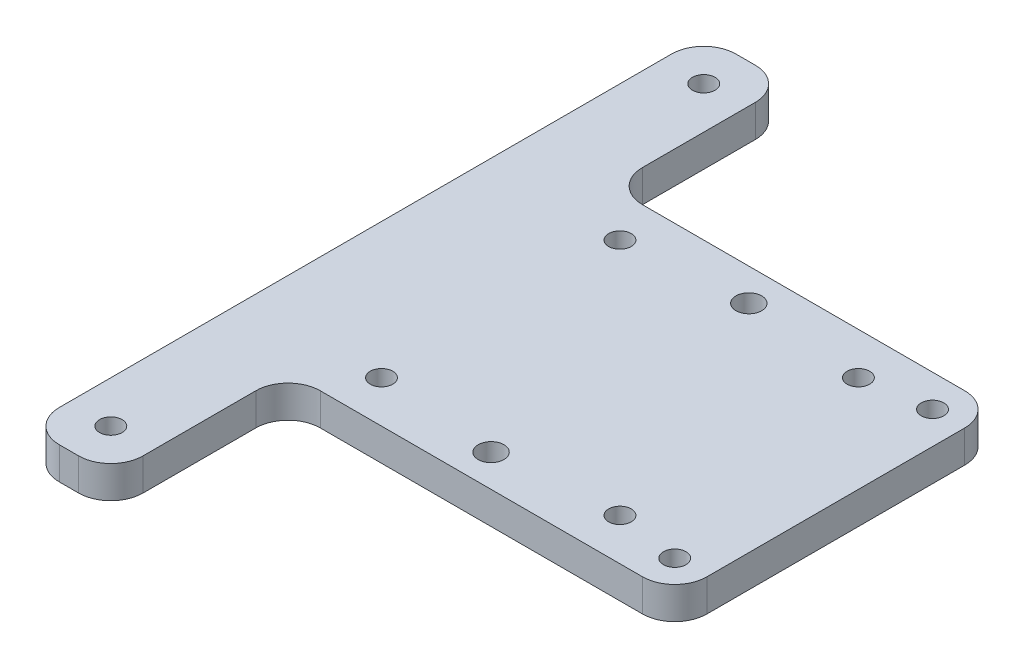
ISO-10303-21;
HEADER;
FILE_DESCRIPTION(('STEP AP214'),'2;1');
FILE_NAME('part.step','',(''),(''),'','','');
FILE_SCHEMA(('AUTOMOTIVE_DESIGN { 1 0 10303 214 1 1 1 1 }'));
ENDSEC;
DATA;
#1=APPLICATION_CONTEXT('core data for automotive mechanical design processes');
#2=APPLICATION_PROTOCOL_DEFINITION('international standard','automotive_design',2000,#1);
#3=PRODUCT_CONTEXT('',#1,'mechanical');
#4=PRODUCT('Part','Part','',(#3));
#5=PRODUCT_RELATED_PRODUCT_CATEGORY('part','',(#4));
#6=PRODUCT_DEFINITION_FORMATION('','',#4);
#7=PRODUCT_DEFINITION_CONTEXT('part definition',#1,'design');
#8=PRODUCT_DEFINITION('design','',#6,#7);
#9=PRODUCT_DEFINITION_SHAPE('','',#8);
#10=(LENGTH_UNIT() NAMED_UNIT(*) SI_UNIT(.MILLI.,.METRE.));
#11=(NAMED_UNIT(*) PLANE_ANGLE_UNIT() SI_UNIT($,.RADIAN.));
#12=(NAMED_UNIT(*) SI_UNIT($,.STERADIAN.) SOLID_ANGLE_UNIT());
#13=UNCERTAINTY_MEASURE_WITH_UNIT(LENGTH_MEASURE(1.E-05),#10,'distance_accuracy_value','');
#14=(GEOMETRIC_REPRESENTATION_CONTEXT(3) GLOBAL_UNCERTAINTY_ASSIGNED_CONTEXT((#13)) GLOBAL_UNIT_ASSIGNED_CONTEXT((#10,
#11,#12)) REPRESENTATION_CONTEXT('',''));
#15=CARTESIAN_POINT('',(0.,0.,0.));
#16=DIRECTION('',(0.,0.,1.));
#17=DIRECTION('',(1.,0.,0.));
#18=AXIS2_PLACEMENT_3D('',#15,#16,#17);
#19=CARTESIAN_POINT('',(0.,5.,-25.));
#20=DIRECTION('',(-1.,0.,0.));
#21=DIRECTION('',(0.,0.,1.));
#22=AXIS2_PLACEMENT_3D('',#19,#20,#21);
#23=PLANE('',#22);
#24=DIRECTION('',(0.,0.,-1.));
#25=VECTOR('',#24,1.);
#26=CARTESIAN_POINT('',(0.,0.,-25.));
#27=LINE('',#26,#25);
#28=CARTESIAN_POINT('',(0.,0.,20.));
#29=VERTEX_POINT('',#28);
#30=CARTESIAN_POINT('',(0.,0.,-20.));
#31=VERTEX_POINT('',#30);
#32=EDGE_CURVE('E265',#29,#31,#27,.T.);
#33=ORIENTED_EDGE('',*,*,#32,.T.);
#34=DIRECTION('',(0.,-1.,0.));
#35=VECTOR('',#34,1.);
#36=CARTESIAN_POINT('',(0.,5.,-20.));
#37=LINE('',#36,#35);
#38=CARTESIAN_POINT('',(0.,5.,-20.));
#39=VERTEX_POINT('',#38);
#40=EDGE_CURVE('E223',#31,#39,#37,.F.);
#41=ORIENTED_EDGE('',*,*,#40,.T.);
#42=DIRECTION('',(0.,0.,-1.));
#43=VECTOR('',#42,1.);
#44=CARTESIAN_POINT('',(0.,5.,-25.));
#45=LINE('',#44,#43);
#46=CARTESIAN_POINT('',(0.,5.,20.));
#47=VERTEX_POINT('',#46);
#48=EDGE_CURVE('E174',#47,#39,#45,.T.);
#49=ORIENTED_EDGE('',*,*,#48,.F.);
#50=DIRECTION('',(0.,-1.,0.));
#51=VECTOR('',#50,1.);
#52=CARTESIAN_POINT('',(0.,5.,20.));
#53=LINE('',#52,#51);
#54=EDGE_CURVE('E220',#47,#29,#53,.T.);
#55=ORIENTED_EDGE('',*,*,#54,.T.);
#56=EDGE_LOOP('',(#33,#41,#49,#55));
#57=FACE_BOUND('',#56,.T.);
#58=ADVANCED_FACE('F33',(#57),#23,.F.);
#59=CARTESIAN_POINT('',(-60.,5.,-25.));
#60=DIRECTION('',(0.,0.,1.));
#61=DIRECTION('',(1.,0.,0.));
#62=AXIS2_PLACEMENT_3D('',#59,#60,#61);
#63=PLANE('',#62);
#64=DIRECTION('',(-1.,0.,0.));
#65=VECTOR('',#64,1.);
#66=CARTESIAN_POINT('',(-60.,0.,-25.));
#67=LINE('',#66,#65);
#68=CARTESIAN_POINT('',(-5.00000000000001,0.,-25.));
#69=VERTEX_POINT('',#68);
#70=CARTESIAN_POINT('',(-55.,0.,-25.));
#71=VERTEX_POINT('',#70);
#72=EDGE_CURVE('E260',#69,#71,#67,.T.);
#73=ORIENTED_EDGE('',*,*,#72,.T.);
#74=DIRECTION('',(0.,-1.,0.));
#75=VECTOR('',#74,1.);
#76=CARTESIAN_POINT('',(-55.,5.,-25.));
#77=LINE('',#76,#75);
#78=CARTESIAN_POINT('',(-55.,5.,-25.));
#79=VERTEX_POINT('',#78);
#80=EDGE_CURVE('E218',#71,#79,#77,.F.);
#81=ORIENTED_EDGE('',*,*,#80,.T.);
#82=DIRECTION('',(-1.,0.,0.));
#83=VECTOR('',#82,1.);
#84=CARTESIAN_POINT('',(-60.,5.,-25.));
#85=LINE('',#84,#83);
#86=CARTESIAN_POINT('',(-5.00000000000001,5.,-25.));
#87=VERTEX_POINT('',#86);
#88=EDGE_CURVE('E246',#87,#79,#85,.T.);
#89=ORIENTED_EDGE('',*,*,#88,.F.);
#90=DIRECTION('',(0.,-1.,0.));
#91=VECTOR('',#90,1.);
#92=CARTESIAN_POINT('',(-5.00000000000001,5.,-25.));
#93=LINE('',#92,#91);
#94=EDGE_CURVE('E215',#87,#69,#93,.T.);
#95=ORIENTED_EDGE('',*,*,#94,.T.);
#96=EDGE_LOOP('',(#73,#81,#89,#95));
#97=FACE_BOUND('',#96,.T.);
#98=ADVANCED_FACE('F263',(#97),#63,.F.);
#99=CARTESIAN_POINT('',(-60.,5.,-52.5));
#100=DIRECTION('',(-1.,0.,0.));
#101=DIRECTION('',(0.,0.,1.));
#102=AXIS2_PLACEMENT_3D('',#99,#100,#101);
#103=PLANE('',#102);
#104=DIRECTION('',(0.,0.,-1.));
#105=VECTOR('',#104,1.);
#106=CARTESIAN_POINT('',(-60.,0.,-52.5));
#107=LINE('',#106,#105);
#108=CARTESIAN_POINT('',(-60.,0.,-30.));
#109=VERTEX_POINT('',#108);
#110=CARTESIAN_POINT('',(-60.,0.,-47.5));
#111=VERTEX_POINT('',#110);
#112=EDGE_CURVE('E261',#109,#111,#107,.T.);
#113=ORIENTED_EDGE('',*,*,#112,.T.);
#114=DIRECTION('',(0.,-1.,0.));
#115=VECTOR('',#114,1.);
#116=CARTESIAN_POINT('',(-60.,5.,-47.5));
#117=LINE('',#116,#115);
#118=CARTESIAN_POINT('',(-60.,5.,-47.5));
#119=VERTEX_POINT('',#118);
#120=EDGE_CURVE('E213',#111,#119,#117,.F.);
#121=ORIENTED_EDGE('',*,*,#120,.T.);
#122=DIRECTION('',(0.,0.,-1.));
#123=VECTOR('',#122,1.);
#124=CARTESIAN_POINT('',(-60.,5.,-52.5));
#125=LINE('',#124,#123);
#126=CARTESIAN_POINT('',(-60.,5.,-30.));
#127=VERTEX_POINT('',#126);
#128=EDGE_CURVE('E243',#127,#119,#125,.T.);
#129=ORIENTED_EDGE('',*,*,#128,.F.);
#130=DIRECTION('',(0.,-1.,0.));
#131=VECTOR('',#130,1.);
#132=CARTESIAN_POINT('',(-60.,0.,-30.));
#133=LINE('',#132,#131);
#134=EDGE_CURVE('E210',#127,#109,#133,.T.);
#135=ORIENTED_EDGE('',*,*,#134,.T.);
#136=EDGE_LOOP('',(#113,#121,#129,#135));
#137=FACE_BOUND('',#136,.T.);
#138=ADVANCED_FACE('F252',(#137),#103,.F.);
#139=CARTESIAN_POINT('',(-73.,5.,-52.5));
#140=DIRECTION('',(0.,0.,1.));
#141=DIRECTION('',(1.,0.,0.));
#142=AXIS2_PLACEMENT_3D('',#139,#140,#141);
#143=PLANE('',#142);
#144=DIRECTION('',(-1.,0.,0.));
#145=VECTOR('',#144,1.);
#146=CARTESIAN_POINT('',(-73.,5.,-52.5));
#147=LINE('',#146,#145);
#148=CARTESIAN_POINT('',(-65.,5.,-52.5));
#149=VERTEX_POINT('',#148);
#150=CARTESIAN_POINT('',(-68.,5.,-52.5));
#151=VERTEX_POINT('',#150);
#152=EDGE_CURVE('E255',#149,#151,#147,.T.);
#153=ORIENTED_EDGE('',*,*,#152,.F.);
#154=DIRECTION('',(0.,-1.,0.));
#155=VECTOR('',#154,1.);
#156=CARTESIAN_POINT('',(-65.,5.,-52.5));
#157=LINE('',#156,#155);
#158=CARTESIAN_POINT('',(-65.,0.,-52.5));
#159=VERTEX_POINT('',#158);
#160=EDGE_CURVE('E207',#149,#159,#157,.T.);
#161=ORIENTED_EDGE('',*,*,#160,.T.);
#162=DIRECTION('',(-1.,0.,0.));
#163=VECTOR('',#162,1.);
#164=CARTESIAN_POINT('',(-73.,0.,-52.5));
#165=LINE('',#164,#163);
#166=CARTESIAN_POINT('',(-68.,0.,-52.5));
#167=VERTEX_POINT('',#166);
#168=EDGE_CURVE('E267',#159,#167,#165,.T.);
#169=ORIENTED_EDGE('',*,*,#168,.T.);
#170=DIRECTION('',(0.,-1.,0.));
#171=VECTOR('',#170,1.);
#172=CARTESIAN_POINT('',(-68.,5.,-52.5));
#173=LINE('',#172,#171);
#174=EDGE_CURVE('E205',#167,#151,#173,.F.);
#175=ORIENTED_EDGE('',*,*,#174,.T.);
#176=EDGE_LOOP('',(#153,#161,#169,#175));
#177=FACE_BOUND('',#176,.T.);
#178=ADVANCED_FACE('F322',(#177),#143,.F.);
#179=CARTESIAN_POINT('',(-73.,5.,-52.5));
#180=DIRECTION('',(1.,0.,0.));
#181=DIRECTION('',(0.,0.,-1.));
#182=AXIS2_PLACEMENT_3D('',#179,#180,#181);
#183=PLANE('',#182);
#184=DIRECTION('',(0.,0.,1.));
#185=VECTOR('',#184,1.);
#186=CARTESIAN_POINT('',(-73.,0.,-52.5));
#187=LINE('',#186,#185);
#188=CARTESIAN_POINT('',(-73.,0.,-47.5));
#189=VERTEX_POINT('',#188);
#190=CARTESIAN_POINT('',(-73.,0.,47.5));
#191=VERTEX_POINT('',#190);
#192=EDGE_CURVE('E176',#189,#191,#187,.T.);
#193=ORIENTED_EDGE('',*,*,#192,.T.);
#194=DIRECTION('',(0.,-1.,0.));
#195=VECTOR('',#194,1.);
#196=CARTESIAN_POINT('',(-73.,5.,47.5));
#197=LINE('',#196,#195);
#198=CARTESIAN_POINT('',(-73.,5.,47.5));
#199=VERTEX_POINT('',#198);
#200=EDGE_CURVE('E232',#191,#199,#197,.F.);
#201=ORIENTED_EDGE('',*,*,#200,.T.);
#202=DIRECTION('',(0.,0.,1.));
#203=VECTOR('',#202,1.);
#204=CARTESIAN_POINT('',(-73.,5.,-52.5));
#205=LINE('',#204,#203);
#206=CARTESIAN_POINT('',(-73.,5.,-47.5));
#207=VERTEX_POINT('',#206);
#208=EDGE_CURVE('E289',#207,#199,#205,.T.);
#209=ORIENTED_EDGE('',*,*,#208,.F.);
#210=DIRECTION('',(0.,-1.,0.));
#211=VECTOR('',#210,1.);
#212=CARTESIAN_POINT('',(-73.,5.,-47.5));
#213=LINE('',#212,#211);
#214=EDGE_CURVE('E229',#207,#189,#213,.T.);
#215=ORIENTED_EDGE('',*,*,#214,.T.);
#216=EDGE_LOOP('',(#193,#201,#209,#215));
#217=FACE_BOUND('',#216,.T.);
#218=ADVANCED_FACE('F279',(#217),#183,.F.);
#219=CARTESIAN_POINT('',(-73.,5.,52.5));
#220=DIRECTION('',(0.,0.,-1.));
#221=DIRECTION('',(-1.,0.,0.));
#222=AXIS2_PLACEMENT_3D('',#219,#220,#221);
#223=PLANE('',#222);
#224=DIRECTION('',(1.,0.,0.));
#225=VECTOR('',#224,1.);
#226=CARTESIAN_POINT('',(-73.,0.,52.5));
#227=LINE('',#226,#225);
#228=CARTESIAN_POINT('',(-68.,0.,52.5));
#229=VERTEX_POINT('',#228);
#230=CARTESIAN_POINT('',(-65.,0.,52.5));
#231=VERTEX_POINT('',#230);
#232=EDGE_CURVE('E172',#229,#231,#227,.T.);
#233=ORIENTED_EDGE('',*,*,#232,.T.);
#234=DIRECTION('',(0.,-1.,0.));
#235=VECTOR('',#234,1.);
#236=CARTESIAN_POINT('',(-65.,5.,52.5));
#237=LINE('',#236,#235);
#238=CARTESIAN_POINT('',(-65.,5.,52.5));
#239=VERTEX_POINT('',#238);
#240=EDGE_CURVE('E151',#231,#239,#237,.F.);
#241=ORIENTED_EDGE('',*,*,#240,.T.);
#242=DIRECTION('',(1.,0.,0.));
#243=VECTOR('',#242,1.);
#244=CARTESIAN_POINT('',(-73.,5.,52.5));
#245=LINE('',#244,#243);
#246=CARTESIAN_POINT('',(-68.,5.,52.5));
#247=VERTEX_POINT('',#246);
#248=EDGE_CURVE('E288',#247,#239,#245,.T.);
#249=ORIENTED_EDGE('',*,*,#248,.F.);
#250=DIRECTION('',(0.,-1.,0.));
#251=VECTOR('',#250,1.);
#252=CARTESIAN_POINT('',(-68.,5.,52.5));
#253=LINE('',#252,#251);
#254=EDGE_CURVE('E156',#247,#229,#253,.T.);
#255=ORIENTED_EDGE('',*,*,#254,.T.);
#256=EDGE_LOOP('',(#233,#241,#249,#255));
#257=FACE_BOUND('',#256,.T.);
#258=ADVANCED_FACE('F291',(#257),#223,.F.);
#259=CARTESIAN_POINT('',(-60.,5.,25.));
#260=DIRECTION('',(-1.,0.,0.));
#261=DIRECTION('',(0.,0.,1.));
#262=AXIS2_PLACEMENT_3D('',#259,#260,#261);
#263=PLANE('',#262);
#264=DIRECTION('',(0.,0.,-1.));
#265=VECTOR('',#264,1.);
#266=CARTESIAN_POINT('',(-60.,5.,25.));
#267=LINE('',#266,#265);
#268=CARTESIAN_POINT('',(-60.,5.,47.5));
#269=VERTEX_POINT('',#268);
#270=CARTESIAN_POINT('',(-60.,5.,30.));
#271=VERTEX_POINT('',#270);
#272=EDGE_CURVE('E165',#269,#271,#267,.T.);
#273=ORIENTED_EDGE('',*,*,#272,.F.);
#274=DIRECTION('',(0.,-1.,0.));
#275=VECTOR('',#274,1.);
#276=CARTESIAN_POINT('',(-60.,5.,47.5));
#277=LINE('',#276,#275);
#278=CARTESIAN_POINT('',(-60.,0.,47.5));
#279=VERTEX_POINT('',#278);
#280=EDGE_CURVE('E150',#269,#279,#277,.T.);
#281=ORIENTED_EDGE('',*,*,#280,.T.);
#282=DIRECTION('',(0.,0.,-1.));
#283=VECTOR('',#282,1.);
#284=CARTESIAN_POINT('',(-60.,0.,25.));
#285=LINE('',#284,#283);
#286=CARTESIAN_POINT('',(-60.,0.,30.));
#287=VERTEX_POINT('',#286);
#288=EDGE_CURVE('E163',#279,#287,#285,.T.);
#289=ORIENTED_EDGE('',*,*,#288,.T.);
#290=DIRECTION('',(0.,-1.,0.));
#291=VECTOR('',#290,1.);
#292=CARTESIAN_POINT('',(-60.,5.,30.));
#293=LINE('',#292,#291);
#294=EDGE_CURVE('E167',#287,#271,#293,.F.);
#295=ORIENTED_EDGE('',*,*,#294,.T.);
#296=EDGE_LOOP('',(#273,#281,#289,#295));
#297=FACE_BOUND('',#296,.T.);
#298=ADVANCED_FACE('F162',(#297),#263,.F.);
#299=CARTESIAN_POINT('',(-60.,5.,25.));
#300=DIRECTION('',(0.,0.,-1.));
#301=DIRECTION('',(-1.,0.,0.));
#302=AXIS2_PLACEMENT_3D('',#299,#300,#301);
#303=PLANE('',#302);
#304=DIRECTION('',(1.,0.,0.));
#305=VECTOR('',#304,1.);
#306=CARTESIAN_POINT('',(-60.,0.,25.));
#307=LINE('',#306,#305);
#308=CARTESIAN_POINT('',(-55.,0.,25.));
#309=VERTEX_POINT('',#308);
#310=CARTESIAN_POINT('',(-5.,0.,25.));
#311=VERTEX_POINT('',#310);
#312=EDGE_CURVE('E171',#309,#311,#307,.T.);
#313=ORIENTED_EDGE('',*,*,#312,.T.);
#314=DIRECTION('',(0.,-1.,0.));
#315=VECTOR('',#314,1.);
#316=CARTESIAN_POINT('',(-5.,5.,25.));
#317=LINE('',#316,#315);
#318=CARTESIAN_POINT('',(-5.,5.,25.));
#319=VERTEX_POINT('',#318);
#320=EDGE_CURVE('E48',#311,#319,#317,.F.);
#321=ORIENTED_EDGE('',*,*,#320,.T.);
#322=DIRECTION('',(1.,0.,0.));
#323=VECTOR('',#322,1.);
#324=CARTESIAN_POINT('',(-60.,5.,25.));
#325=LINE('',#324,#323);
#326=CARTESIAN_POINT('',(-55.,5.,25.));
#327=VERTEX_POINT('',#326);
#328=EDGE_CURVE('E180',#327,#319,#325,.T.);
#329=ORIENTED_EDGE('',*,*,#328,.F.);
#330=DIRECTION('',(0.,-1.,0.));
#331=VECTOR('',#330,1.);
#332=CARTESIAN_POINT('',(-55.,0.,25.));
#333=LINE('',#332,#331);
#334=EDGE_CURVE('E225',#327,#309,#333,.T.);
#335=ORIENTED_EDGE('',*,*,#334,.T.);
#336=EDGE_LOOP('',(#313,#321,#329,#335));
#337=FACE_BOUND('',#336,.T.);
#338=ADVANCED_FACE('F350',(#337),#303,.F.);
#339=CARTESIAN_POINT('',(0.,5.,0.));
#340=DIRECTION('',(0.,1.,0.));
#341=DIRECTION('',(0.,0.,1.));
#342=AXIS2_PLACEMENT_3D('',#339,#340,#341);
#343=PLANE('',#342);
#344=CARTESIAN_POINT('',(-15.,5.,18.5));
#345=DIRECTION('',(0.,1.,0.));
#346=DIRECTION('',(0.,0.,1.));
#347=AXIS2_PLACEMENT_3D('',#344,#345,#346);
#348=CIRCLE('',#347,1.75);
#349=CARTESIAN_POINT('',(-15.,5.,20.25));
#350=VERTEX_POINT('',#349);
#351=EDGE_CURVE('E416',#350,#350,#348,.T.);
#352=ORIENTED_EDGE('',*,*,#351,.F.);
#353=EDGE_LOOP('',(#352));
#354=FACE_BOUND('',#353,.T.);
#355=CARTESIAN_POINT('',(-15.,5.,-18.5));
#356=DIRECTION('',(0.,1.,0.));
#357=DIRECTION('',(0.,0.,1.));
#358=AXIS2_PLACEMENT_3D('',#355,#356,#357);
#359=CIRCLE('',#358,1.75);
#360=CARTESIAN_POINT('',(-15.,5.,-16.75));
#361=VERTEX_POINT('',#360);
#362=EDGE_CURVE('E422',#361,#361,#359,.T.);
#363=ORIENTED_EDGE('',*,*,#362,.F.);
#364=EDGE_LOOP('',(#363));
#365=FACE_BOUND('',#364,.T.);
#366=CARTESIAN_POINT('',(-52.,5.,-18.5));
#367=DIRECTION('',(0.,1.,0.));
#368=DIRECTION('',(0.,0.,1.));
#369=AXIS2_PLACEMENT_3D('',#366,#367,#368);
#370=CIRCLE('',#369,1.75);
#371=CARTESIAN_POINT('',(-52.,5.,-16.75));
#372=VERTEX_POINT('',#371);
#373=EDGE_CURVE('E428',#372,#372,#370,.T.);
#374=ORIENTED_EDGE('',*,*,#373,.F.);
#375=EDGE_LOOP('',(#374));
#376=FACE_BOUND('',#375,.T.);
#377=CARTESIAN_POINT('',(-33.5,5.,-20.));
#378=DIRECTION('',(0.,1.,0.));
#379=DIRECTION('',(0.,0.,1.));
#380=AXIS2_PLACEMENT_3D('',#377,#378,#379);
#381=CIRCLE('',#380,2.);
#382=CARTESIAN_POINT('',(-33.5,5.,-18.));
#383=VERTEX_POINT('',#382);
#384=EDGE_CURVE('E409',#383,#383,#381,.T.);
#385=ORIENTED_EDGE('',*,*,#384,.F.);
#386=EDGE_LOOP('',(#385));
#387=FACE_BOUND('',#386,.T.);
#388=CARTESIAN_POINT('',(-33.5,5.,20.));
#389=DIRECTION('',(0.,1.,0.));
#390=DIRECTION('',(0.,0.,1.));
#391=AXIS2_PLACEMENT_3D('',#388,#389,#390);
#392=CIRCLE('',#391,2.);
#393=CARTESIAN_POINT('',(-33.5,5.,22.));
#394=VERTEX_POINT('',#393);
#395=EDGE_CURVE('E406',#394,#394,#392,.T.);
#396=ORIENTED_EDGE('',*,*,#395,.F.);
#397=EDGE_LOOP('',(#396));
#398=FACE_BOUND('',#397,.T.);
#399=CARTESIAN_POINT('',(-52.,5.,18.5));
#400=DIRECTION('',(0.,1.,0.));
#401=DIRECTION('',(0.,0.,1.));
#402=AXIS2_PLACEMENT_3D('',#399,#400,#401);
#403=CIRCLE('',#402,1.75);
#404=CARTESIAN_POINT('',(-52.,5.,20.25));
#405=VERTEX_POINT('',#404);
#406=EDGE_CURVE('E415',#405,#405,#403,.T.);
#407=ORIENTED_EDGE('',*,*,#406,.F.);
#408=EDGE_LOOP('',(#407));
#409=FACE_BOUND('',#408,.T.);
#410=CARTESIAN_POINT('',(-5.00000000000001,5.,-20.));
#411=DIRECTION('',(0.,1.,0.));
#412=DIRECTION('',(0.,0.,1.));
#413=AXIS2_PLACEMENT_3D('',#410,#411,#412);
#414=CIRCLE('',#413,1.75);
#415=CARTESIAN_POINT('',(-5.00000000000001,5.,-18.25));
#416=VERTEX_POINT('',#415);
#417=EDGE_CURVE('E445',#416,#416,#414,.T.);
#418=ORIENTED_EDGE('',*,*,#417,.F.);
#419=EDGE_LOOP('',(#418));
#420=FACE_BOUND('',#419,.T.);
#421=CARTESIAN_POINT('',(-5.,5.,20.));
#422=DIRECTION('',(0.,1.,0.));
#423=DIRECTION('',(0.,0.,1.));
#424=AXIS2_PLACEMENT_3D('',#421,#422,#423);
#425=CIRCLE('',#424,1.75);
#426=CARTESIAN_POINT('',(-5.,5.,21.75));
#427=VERTEX_POINT('',#426);
#428=EDGE_CURVE('E439',#427,#427,#425,.T.);
#429=ORIENTED_EDGE('',*,*,#428,.F.);
#430=EDGE_LOOP('',(#429));
#431=FACE_BOUND('',#430,.T.);
#432=CARTESIAN_POINT('',(-66.5,5.,-46.));
#433=DIRECTION('',(0.,-1.,0.));
#434=DIRECTION('',(0.,0.,-1.));
#435=AXIS2_PLACEMENT_3D('',#432,#433,#434);
#436=CIRCLE('',#435,1.75);
#437=CARTESIAN_POINT('',(-66.5,5.,-47.75));
#438=VERTEX_POINT('',#437);
#439=EDGE_CURVE('E270',#438,#438,#436,.T.);
#440=ORIENTED_EDGE('',*,*,#439,.T.);
#441=EDGE_LOOP('',(#440));
#442=FACE_BOUND('',#441,.T.);
#443=CARTESIAN_POINT('',(-66.5,5.,46.));
#444=DIRECTION('',(0.,-1.,0.));
#445=DIRECTION('',(0.,0.,-1.));
#446=AXIS2_PLACEMENT_3D('',#443,#444,#445);
#447=CIRCLE('',#446,1.75);
#448=CARTESIAN_POINT('',(-66.5,5.,44.25));
#449=VERTEX_POINT('',#448);
#450=EDGE_CURVE('E457',#449,#449,#447,.T.);
#451=ORIENTED_EDGE('',*,*,#450,.T.);
#452=EDGE_LOOP('',(#451));
#453=FACE_BOUND('',#452,.T.);
#454=ORIENTED_EDGE('',*,*,#248,.T.);
#455=CARTESIAN_POINT('',(-65.,5.,47.5));
#456=DIRECTION('',(0.,1.,0.));
#457=DIRECTION('',(0.,0.,1.));
#458=AXIS2_PLACEMENT_3D('',#455,#456,#457);
#459=CIRCLE('',#458,5.);
#460=EDGE_CURVE('E203',#239,#269,#459,.T.);
#461=ORIENTED_EDGE('',*,*,#460,.T.);
#462=ORIENTED_EDGE('',*,*,#272,.T.);
#463=CARTESIAN_POINT('',(-55.,5.,30.));
#464=DIRECTION('',(0.,1.,0.));
#465=DIRECTION('',(0.,0.,1.));
#466=AXIS2_PLACEMENT_3D('',#463,#464,#465);
#467=CIRCLE('',#466,5.);
#468=EDGE_CURVE('E11',#271,#327,#467,.F.);
#469=ORIENTED_EDGE('',*,*,#468,.T.);
#470=ORIENTED_EDGE('',*,*,#328,.T.);
#471=CARTESIAN_POINT('',(-5.,5.,20.));
#472=DIRECTION('',(0.,1.,0.));
#473=DIRECTION('',(0.,0.,1.));
#474=AXIS2_PLACEMENT_3D('',#471,#472,#473);
#475=CIRCLE('',#474,5.);
#476=EDGE_CURVE('E197',#319,#47,#475,.T.);
#477=ORIENTED_EDGE('',*,*,#476,.T.);
#478=ORIENTED_EDGE('',*,*,#48,.T.);
#479=CARTESIAN_POINT('',(-5.00000000000001,5.,-20.));
#480=DIRECTION('',(0.,1.,0.));
#481=DIRECTION('',(0.,0.,1.));
#482=AXIS2_PLACEMENT_3D('',#479,#480,#481);
#483=CIRCLE('',#482,5.);
#484=EDGE_CURVE('E199',#39,#87,#483,.T.);
#485=ORIENTED_EDGE('',*,*,#484,.T.);
#486=ORIENTED_EDGE('',*,*,#88,.T.);
#487=CARTESIAN_POINT('',(-55.,5.,-30.));
#488=DIRECTION('',(0.,1.,0.));
#489=DIRECTION('',(0.,0.,1.));
#490=AXIS2_PLACEMENT_3D('',#487,#488,#489);
#491=CIRCLE('',#490,5.);
#492=EDGE_CURVE('E236',#79,#127,#491,.F.);
#493=ORIENTED_EDGE('',*,*,#492,.T.);
#494=ORIENTED_EDGE('',*,*,#128,.T.);
#495=CARTESIAN_POINT('',(-65.,5.,-47.5));
#496=DIRECTION('',(0.,1.,0.));
#497=DIRECTION('',(0.,0.,1.));
#498=AXIS2_PLACEMENT_3D('',#495,#496,#497);
#499=CIRCLE('',#498,5.);
#500=EDGE_CURVE('E201',#119,#149,#499,.T.);
#501=ORIENTED_EDGE('',*,*,#500,.T.);
#502=ORIENTED_EDGE('',*,*,#152,.T.);
#503=CARTESIAN_POINT('',(-68.,5.,-47.5));
#504=DIRECTION('',(0.,1.,0.));
#505=DIRECTION('',(0.,0.,1.));
#506=AXIS2_PLACEMENT_3D('',#503,#504,#505);
#507=CIRCLE('',#506,5.);
#508=EDGE_CURVE('E193',#151,#207,#507,.T.);
#509=ORIENTED_EDGE('',*,*,#508,.T.);
#510=ORIENTED_EDGE('',*,*,#208,.T.);
#511=CARTESIAN_POINT('',(-68.,5.,47.5));
#512=DIRECTION('',(0.,1.,0.));
#513=DIRECTION('',(0.,0.,1.));
#514=AXIS2_PLACEMENT_3D('',#511,#512,#513);
#515=CIRCLE('',#514,5.);
#516=EDGE_CURVE('E195',#199,#247,#515,.T.);
#517=ORIENTED_EDGE('',*,*,#516,.T.);
#518=EDGE_LOOP('',(#454,#461,#462,#469,#470,#477,#478,#485,#486,#493,#494,#501,#502,#509,#510,#517));
#519=FACE_BOUND('',#518,.T.);
#520=ADVANCED_FACE('F242',(#354,#365,#376,#387,#398,#409,#420,#431,#442,#453,#519),#343,.T.);
#521=CARTESIAN_POINT('',(0.,0.,0.));
#522=DIRECTION('',(0.,1.,0.));
#523=DIRECTION('',(0.,0.,1.));
#524=AXIS2_PLACEMENT_3D('',#521,#522,#523);
#525=PLANE('',#524);
#526=CARTESIAN_POINT('',(-15.,0.,18.5));
#527=DIRECTION('',(0.,1.,0.));
#528=DIRECTION('',(0.,0.,1.));
#529=AXIS2_PLACEMENT_3D('',#526,#527,#528);
#530=CIRCLE('',#529,1.75);
#531=CARTESIAN_POINT('',(-15.,0.,20.25));
#532=VERTEX_POINT('',#531);
#533=EDGE_CURVE('E412',#532,#532,#530,.T.);
#534=ORIENTED_EDGE('',*,*,#533,.T.);
#535=EDGE_LOOP('',(#534));
#536=FACE_BOUND('',#535,.T.);
#537=CARTESIAN_POINT('',(-15.,0.,-18.5));
#538=DIRECTION('',(0.,1.,0.));
#539=DIRECTION('',(0.,0.,1.));
#540=AXIS2_PLACEMENT_3D('',#537,#538,#539);
#541=CIRCLE('',#540,1.75);
#542=CARTESIAN_POINT('',(-15.,0.,-16.75));
#543=VERTEX_POINT('',#542);
#544=EDGE_CURVE('E419',#543,#543,#541,.T.);
#545=ORIENTED_EDGE('',*,*,#544,.T.);
#546=EDGE_LOOP('',(#545));
#547=FACE_BOUND('',#546,.T.);
#548=CARTESIAN_POINT('',(-52.,0.,-18.5));
#549=DIRECTION('',(0.,1.,0.));
#550=DIRECTION('',(0.,0.,1.));
#551=AXIS2_PLACEMENT_3D('',#548,#549,#550);
#552=CIRCLE('',#551,1.75);
#553=CARTESIAN_POINT('',(-52.,0.,-16.75));
#554=VERTEX_POINT('',#553);
#555=EDGE_CURVE('E425',#554,#554,#552,.T.);
#556=ORIENTED_EDGE('',*,*,#555,.T.);
#557=EDGE_LOOP('',(#556));
#558=FACE_BOUND('',#557,.T.);
#559=CARTESIAN_POINT('',(-33.5,0.,-20.));
#560=DIRECTION('',(0.,1.,0.));
#561=DIRECTION('',(0.,0.,1.));
#562=AXIS2_PLACEMENT_3D('',#559,#560,#561);
#563=CIRCLE('',#562,2.);
#564=CARTESIAN_POINT('',(-33.5,0.,-18.));
#565=VERTEX_POINT('',#564);
#566=EDGE_CURVE('E431',#565,#565,#563,.T.);
#567=ORIENTED_EDGE('',*,*,#566,.T.);
#568=EDGE_LOOP('',(#567));
#569=FACE_BOUND('',#568,.T.);
#570=CARTESIAN_POINT('',(-33.5,0.,20.));
#571=DIRECTION('',(0.,1.,0.));
#572=DIRECTION('',(0.,0.,1.));
#573=AXIS2_PLACEMENT_3D('',#570,#571,#572);
#574=CIRCLE('',#573,2.);
#575=CARTESIAN_POINT('',(-33.5,0.,22.));
#576=VERTEX_POINT('',#575);
#577=EDGE_CURVE('E403',#576,#576,#574,.T.);
#578=ORIENTED_EDGE('',*,*,#577,.T.);
#579=EDGE_LOOP('',(#578));
#580=FACE_BOUND('',#579,.T.);
#581=CARTESIAN_POINT('',(-52.,0.,18.5));
#582=DIRECTION('',(0.,1.,0.));
#583=DIRECTION('',(0.,0.,1.));
#584=AXIS2_PLACEMENT_3D('',#581,#582,#583);
#585=CIRCLE('',#584,1.75);
#586=CARTESIAN_POINT('',(-52.,0.,20.25));
#587=VERTEX_POINT('',#586);
#588=EDGE_CURVE('E436',#587,#587,#585,.T.);
#589=ORIENTED_EDGE('',*,*,#588,.T.);
#590=EDGE_LOOP('',(#589));
#591=FACE_BOUND('',#590,.T.);
#592=CARTESIAN_POINT('',(-5.00000000000001,0.,-20.));
#593=DIRECTION('',(0.,1.,0.));
#594=DIRECTION('',(0.,0.,1.));
#595=AXIS2_PLACEMENT_3D('',#592,#593,#594);
#596=CIRCLE('',#595,1.75);
#597=CARTESIAN_POINT('',(-5.00000000000001,0.,-18.25));
#598=VERTEX_POINT('',#597);
#599=EDGE_CURVE('E442',#598,#598,#596,.T.);
#600=ORIENTED_EDGE('',*,*,#599,.T.);
#601=EDGE_LOOP('',(#600));
#602=FACE_BOUND('',#601,.T.);
#603=CARTESIAN_POINT('',(-5.,0.,20.));
#604=DIRECTION('',(0.,1.,0.));
#605=DIRECTION('',(0.,0.,1.));
#606=AXIS2_PLACEMENT_3D('',#603,#604,#605);
#607=CIRCLE('',#606,1.75);
#608=CARTESIAN_POINT('',(-5.,0.,21.75));
#609=VERTEX_POINT('',#608);
#610=EDGE_CURVE('E448',#609,#609,#607,.T.);
#611=ORIENTED_EDGE('',*,*,#610,.T.);
#612=EDGE_LOOP('',(#611));
#613=FACE_BOUND('',#612,.T.);
#614=CARTESIAN_POINT('',(-66.5,0.,-46.));
#615=DIRECTION('',(0.,-1.,0.));
#616=DIRECTION('',(0.,0.,-1.));
#617=AXIS2_PLACEMENT_3D('',#614,#615,#616);
#618=CIRCLE('',#617,1.75);
#619=CARTESIAN_POINT('',(-66.5,0.,-47.75));
#620=VERTEX_POINT('',#619);
#621=EDGE_CURVE('E455',#620,#620,#618,.T.);
#622=ORIENTED_EDGE('',*,*,#621,.F.);
#623=EDGE_LOOP('',(#622));
#624=FACE_BOUND('',#623,.T.);
#625=CARTESIAN_POINT('',(-66.5,0.,46.));
#626=DIRECTION('',(0.,-1.,0.));
#627=DIRECTION('',(0.,0.,-1.));
#628=AXIS2_PLACEMENT_3D('',#625,#626,#627);
#629=CIRCLE('',#628,1.75);
#630=CARTESIAN_POINT('',(-66.5,0.,44.25));
#631=VERTEX_POINT('',#630);
#632=EDGE_CURVE('E312',#631,#631,#629,.T.);
#633=ORIENTED_EDGE('',*,*,#632,.F.);
#634=EDGE_LOOP('',(#633));
#635=FACE_BOUND('',#634,.T.);
#636=ORIENTED_EDGE('',*,*,#288,.F.);
#637=CARTESIAN_POINT('',(-65.,0.,47.5));
#638=DIRECTION('',(0.,1.,0.));
#639=DIRECTION('',(0.,0.,1.));
#640=AXIS2_PLACEMENT_3D('',#637,#638,#639);
#641=CIRCLE('',#640,5.);
#642=EDGE_CURVE('E146',#279,#231,#641,.F.);
#643=ORIENTED_EDGE('',*,*,#642,.T.);
#644=ORIENTED_EDGE('',*,*,#232,.F.);
#645=CARTESIAN_POINT('',(-68.,0.,47.5));
#646=DIRECTION('',(0.,1.,0.));
#647=DIRECTION('',(0.,0.,1.));
#648=AXIS2_PLACEMENT_3D('',#645,#646,#647);
#649=CIRCLE('',#648,5.);
#650=EDGE_CURVE('E183',#229,#191,#649,.F.);
#651=ORIENTED_EDGE('',*,*,#650,.T.);
#652=ORIENTED_EDGE('',*,*,#192,.F.);
#653=CARTESIAN_POINT('',(-68.,0.,-47.5));
#654=DIRECTION('',(0.,1.,0.));
#655=DIRECTION('',(0.,0.,1.));
#656=AXIS2_PLACEMENT_3D('',#653,#654,#655);
#657=CIRCLE('',#656,5.);
#658=EDGE_CURVE('E166',#189,#167,#657,.F.);
#659=ORIENTED_EDGE('',*,*,#658,.T.);
#660=ORIENTED_EDGE('',*,*,#168,.F.);
#661=CARTESIAN_POINT('',(-65.,0.,-47.5));
#662=DIRECTION('',(0.,1.,0.));
#663=DIRECTION('',(0.,0.,1.));
#664=AXIS2_PLACEMENT_3D('',#661,#662,#663);
#665=CIRCLE('',#664,5.);
#666=EDGE_CURVE('E157',#159,#111,#665,.F.);
#667=ORIENTED_EDGE('',*,*,#666,.T.);
#668=ORIENTED_EDGE('',*,*,#112,.F.);
#669=CARTESIAN_POINT('',(-55.,0.,-30.));
#670=DIRECTION('',(0.,1.,0.));
#671=DIRECTION('',(0.,0.,1.));
#672=AXIS2_PLACEMENT_3D('',#669,#670,#671);
#673=CIRCLE('',#672,5.);
#674=EDGE_CURVE('E234',#109,#71,#673,.T.);
#675=ORIENTED_EDGE('',*,*,#674,.T.);
#676=ORIENTED_EDGE('',*,*,#72,.F.);
#677=CARTESIAN_POINT('',(-5.00000000000001,0.,-20.));
#678=DIRECTION('',(0.,1.,0.));
#679=DIRECTION('',(0.,0.,1.));
#680=AXIS2_PLACEMENT_3D('',#677,#678,#679);
#681=CIRCLE('',#680,5.);
#682=EDGE_CURVE('E187',#69,#31,#681,.F.);
#683=ORIENTED_EDGE('',*,*,#682,.T.);
#684=ORIENTED_EDGE('',*,*,#32,.F.);
#685=CARTESIAN_POINT('',(-5.,0.,20.));
#686=DIRECTION('',(0.,1.,0.));
#687=DIRECTION('',(0.,0.,1.));
#688=AXIS2_PLACEMENT_3D('',#685,#686,#687);
#689=CIRCLE('',#688,5.);
#690=EDGE_CURVE('E185',#29,#311,#689,.F.);
#691=ORIENTED_EDGE('',*,*,#690,.T.);
#692=ORIENTED_EDGE('',*,*,#312,.F.);
#693=CARTESIAN_POINT('',(-55.,0.,30.));
#694=DIRECTION('',(0.,1.,0.));
#695=DIRECTION('',(0.,0.,1.));
#696=AXIS2_PLACEMENT_3D('',#693,#694,#695);
#697=CIRCLE('',#696,5.);
#698=EDGE_CURVE('E41',#309,#287,#697,.T.);
#699=ORIENTED_EDGE('',*,*,#698,.T.);
#700=EDGE_LOOP('',(#636,#643,#644,#651,#652,#659,#660,#667,#668,#675,#676,#683,#684,#691,#692,#699));
#701=FACE_BOUND('',#700,.T.);
#702=ADVANCED_FACE('F169',(#536,#547,#558,#569,#580,#591,#602,#613,#624,#635,#701),#525,.F.);
#703=CARTESIAN_POINT('',(-65.,5.,47.5));
#704=DIRECTION('',(0.,-1.,0.));
#705=DIRECTION('',(0.,0.,-1.));
#706=AXIS2_PLACEMENT_3D('',#703,#704,#705);
#707=CYLINDRICAL_SURFACE('',#706,5.);
#708=ORIENTED_EDGE('',*,*,#460,.F.);
#709=ORIENTED_EDGE('',*,*,#240,.F.);
#710=ORIENTED_EDGE('',*,*,#642,.F.);
#711=ORIENTED_EDGE('',*,*,#280,.F.);
#712=EDGE_LOOP('',(#708,#709,#710,#711));
#713=FACE_BOUND('',#712,.T.);
#714=ADVANCED_FACE('F149',(#713),#707,.T.);
#715=CARTESIAN_POINT('',(-65.,5.,-47.5));
#716=DIRECTION('',(0.,-1.,0.));
#717=DIRECTION('',(0.,0.,-1.));
#718=AXIS2_PLACEMENT_3D('',#715,#716,#717);
#719=CYLINDRICAL_SURFACE('',#718,5.);
#720=ORIENTED_EDGE('',*,*,#500,.F.);
#721=ORIENTED_EDGE('',*,*,#120,.F.);
#722=ORIENTED_EDGE('',*,*,#666,.F.);
#723=ORIENTED_EDGE('',*,*,#160,.F.);
#724=EDGE_LOOP('',(#720,#721,#722,#723));
#725=FACE_BOUND('',#724,.T.);
#726=ADVANCED_FACE('F324',(#725),#719,.T.);
#727=CARTESIAN_POINT('',(-55.,5.,-30.));
#728=DIRECTION('',(0.,1.,0.));
#729=DIRECTION('',(0.,0.,1.));
#730=AXIS2_PLACEMENT_3D('',#727,#728,#729);
#731=CYLINDRICAL_SURFACE('',#730,5.);
#732=ORIENTED_EDGE('',*,*,#492,.F.);
#733=ORIENTED_EDGE('',*,*,#80,.F.);
#734=ORIENTED_EDGE('',*,*,#674,.F.);
#735=ORIENTED_EDGE('',*,*,#134,.F.);
#736=EDGE_LOOP('',(#732,#733,#734,#735));
#737=FACE_BOUND('',#736,.T.);
#738=ADVANCED_FACE('F257',(#737),#731,.F.);
#739=CARTESIAN_POINT('',(-5.00000000000001,5.,-20.));
#740=DIRECTION('',(0.,-1.,0.));
#741=DIRECTION('',(0.,0.,-1.));
#742=AXIS2_PLACEMENT_3D('',#739,#740,#741);
#743=CYLINDRICAL_SURFACE('',#742,5.);
#744=ORIENTED_EDGE('',*,*,#484,.F.);
#745=ORIENTED_EDGE('',*,*,#40,.F.);
#746=ORIENTED_EDGE('',*,*,#682,.F.);
#747=ORIENTED_EDGE('',*,*,#94,.F.);
#748=EDGE_LOOP('',(#744,#745,#746,#747));
#749=FACE_BOUND('',#748,.T.);
#750=ADVANCED_FACE('F308',(#749),#743,.T.);
#751=CARTESIAN_POINT('',(-5.,5.,20.));
#752=DIRECTION('',(0.,-1.,0.));
#753=DIRECTION('',(0.,0.,-1.));
#754=AXIS2_PLACEMENT_3D('',#751,#752,#753);
#755=CYLINDRICAL_SURFACE('',#754,5.);
#756=ORIENTED_EDGE('',*,*,#476,.F.);
#757=ORIENTED_EDGE('',*,*,#320,.F.);
#758=ORIENTED_EDGE('',*,*,#690,.F.);
#759=ORIENTED_EDGE('',*,*,#54,.F.);
#760=EDGE_LOOP('',(#756,#757,#758,#759));
#761=FACE_BOUND('',#760,.T.);
#762=ADVANCED_FACE('F302',(#761),#755,.T.);
#763=CARTESIAN_POINT('',(-55.,5.,30.));
#764=DIRECTION('',(0.,1.,0.));
#765=DIRECTION('',(0.,0.,1.));
#766=AXIS2_PLACEMENT_3D('',#763,#764,#765);
#767=CYLINDRICAL_SURFACE('',#766,5.);
#768=ORIENTED_EDGE('',*,*,#468,.F.);
#769=ORIENTED_EDGE('',*,*,#294,.F.);
#770=ORIENTED_EDGE('',*,*,#698,.F.);
#771=ORIENTED_EDGE('',*,*,#334,.F.);
#772=EDGE_LOOP('',(#768,#769,#770,#771));
#773=FACE_BOUND('',#772,.T.);
#774=ADVANCED_FACE('F572',(#773),#767,.F.);
#775=CARTESIAN_POINT('',(-68.,5.,47.5));
#776=DIRECTION('',(0.,-1.,0.));
#777=DIRECTION('',(0.,0.,-1.));
#778=AXIS2_PLACEMENT_3D('',#775,#776,#777);
#779=CYLINDRICAL_SURFACE('',#778,5.);
#780=ORIENTED_EDGE('',*,*,#516,.F.);
#781=ORIENTED_EDGE('',*,*,#200,.F.);
#782=ORIENTED_EDGE('',*,*,#650,.F.);
#783=ORIENTED_EDGE('',*,*,#254,.F.);
#784=EDGE_LOOP('',(#780,#781,#782,#783));
#785=FACE_BOUND('',#784,.T.);
#786=ADVANCED_FACE('F285',(#785),#779,.T.);
#787=CARTESIAN_POINT('',(-68.,5.,-47.5));
#788=DIRECTION('',(0.,-1.,0.));
#789=DIRECTION('',(0.,0.,-1.));
#790=AXIS2_PLACEMENT_3D('',#787,#788,#789);
#791=CYLINDRICAL_SURFACE('',#790,5.);
#792=ORIENTED_EDGE('',*,*,#508,.F.);
#793=ORIENTED_EDGE('',*,*,#174,.F.);
#794=ORIENTED_EDGE('',*,*,#658,.F.);
#795=ORIENTED_EDGE('',*,*,#214,.F.);
#796=EDGE_LOOP('',(#792,#793,#794,#795));
#797=FACE_BOUND('',#796,.T.);
#798=ADVANCED_FACE('F35',(#797),#791,.T.);
#799=CARTESIAN_POINT('',(-66.5,5.,46.));
#800=DIRECTION('',(0.,-1.,0.));
#801=DIRECTION('',(0.,0.,-1.));
#802=AXIS2_PLACEMENT_3D('',#799,#800,#801);
#803=CYLINDRICAL_SURFACE('',#802,1.75);
#804=ORIENTED_EDGE('',*,*,#450,.F.);
#805=EDGE_LOOP('',(#804));
#806=FACE_BOUND('',#805,.T.);
#807=ORIENTED_EDGE('',*,*,#632,.T.);
#808=EDGE_LOOP('',(#807));
#809=FACE_BOUND('',#808,.T.);
#810=ADVANCED_FACE('F359',(#806,#809),#803,.F.);
#811=CARTESIAN_POINT('',(-66.5,5.,-46.));
#812=DIRECTION('',(0.,-1.,0.));
#813=DIRECTION('',(0.,0.,-1.));
#814=AXIS2_PLACEMENT_3D('',#811,#812,#813);
#815=CYLINDRICAL_SURFACE('',#814,1.75);
#816=ORIENTED_EDGE('',*,*,#439,.F.);
#817=EDGE_LOOP('',(#816));
#818=FACE_BOUND('',#817,.T.);
#819=ORIENTED_EDGE('',*,*,#621,.T.);
#820=EDGE_LOOP('',(#819));
#821=FACE_BOUND('',#820,.T.);
#822=ADVANCED_FACE('F362',(#818,#821),#815,.F.);
#823=CARTESIAN_POINT('',(-5.,0.,20.));
#824=DIRECTION('',(0.,1.,0.));
#825=DIRECTION('',(0.,0.,1.));
#826=AXIS2_PLACEMENT_3D('',#823,#824,#825);
#827=CYLINDRICAL_SURFACE('',#826,1.75);
#828=ORIENTED_EDGE('',*,*,#610,.F.);
#829=EDGE_LOOP('',(#828));
#830=FACE_BOUND('',#829,.T.);
#831=ORIENTED_EDGE('',*,*,#428,.T.);
#832=EDGE_LOOP('',(#831));
#833=FACE_BOUND('',#832,.T.);
#834=ADVANCED_FACE('F366',(#830,#833),#827,.F.);
#835=CARTESIAN_POINT('',(-5.00000000000001,0.,-20.));
#836=DIRECTION('',(0.,1.,0.));
#837=DIRECTION('',(0.,0.,1.));
#838=AXIS2_PLACEMENT_3D('',#835,#836,#837);
#839=CYLINDRICAL_SURFACE('',#838,1.75);
#840=ORIENTED_EDGE('',*,*,#599,.F.);
#841=EDGE_LOOP('',(#840));
#842=FACE_BOUND('',#841,.T.);
#843=ORIENTED_EDGE('',*,*,#417,.T.);
#844=EDGE_LOOP('',(#843));
#845=FACE_BOUND('',#844,.T.);
#846=ADVANCED_FACE('F370',(#842,#845),#839,.F.);
#847=CARTESIAN_POINT('',(-52.,0.,18.5));
#848=DIRECTION('',(0.,1.,0.));
#849=DIRECTION('',(0.,0.,1.));
#850=AXIS2_PLACEMENT_3D('',#847,#848,#849);
#851=CYLINDRICAL_SURFACE('',#850,1.75);
#852=ORIENTED_EDGE('',*,*,#588,.F.);
#853=EDGE_LOOP('',(#852));
#854=FACE_BOUND('',#853,.T.);
#855=ORIENTED_EDGE('',*,*,#406,.T.);
#856=EDGE_LOOP('',(#855));
#857=FACE_BOUND('',#856,.T.);
#858=ADVANCED_FACE('F374',(#854,#857),#851,.F.);
#859=CARTESIAN_POINT('',(-33.5,0.,20.));
#860=DIRECTION('',(0.,1.,0.));
#861=DIRECTION('',(0.,0.,1.));
#862=AXIS2_PLACEMENT_3D('',#859,#860,#861);
#863=CYLINDRICAL_SURFACE('',#862,2.);
#864=ORIENTED_EDGE('',*,*,#577,.F.);
#865=EDGE_LOOP('',(#864));
#866=FACE_BOUND('',#865,.T.);
#867=ORIENTED_EDGE('',*,*,#395,.T.);
#868=EDGE_LOOP('',(#867));
#869=FACE_BOUND('',#868,.T.);
#870=ADVANCED_FACE('F378',(#866,#869),#863,.F.);
#871=CARTESIAN_POINT('',(-33.5,0.,-20.));
#872=DIRECTION('',(0.,1.,0.));
#873=DIRECTION('',(0.,0.,1.));
#874=AXIS2_PLACEMENT_3D('',#871,#872,#873);
#875=CYLINDRICAL_SURFACE('',#874,2.);
#876=ORIENTED_EDGE('',*,*,#566,.F.);
#877=EDGE_LOOP('',(#876));
#878=FACE_BOUND('',#877,.T.);
#879=ORIENTED_EDGE('',*,*,#384,.T.);
#880=EDGE_LOOP('',(#879));
#881=FACE_BOUND('',#880,.T.);
#882=ADVANCED_FACE('F380',(#878,#881),#875,.F.);
#883=CARTESIAN_POINT('',(-52.,0.,-18.5));
#884=DIRECTION('',(0.,1.,0.));
#885=DIRECTION('',(0.,0.,1.));
#886=AXIS2_PLACEMENT_3D('',#883,#884,#885);
#887=CYLINDRICAL_SURFACE('',#886,1.75);
#888=ORIENTED_EDGE('',*,*,#555,.F.);
#889=EDGE_LOOP('',(#888));
#890=FACE_BOUND('',#889,.T.);
#891=ORIENTED_EDGE('',*,*,#373,.T.);
#892=EDGE_LOOP('',(#891));
#893=FACE_BOUND('',#892,.T.);
#894=ADVANCED_FACE('F383',(#890,#893),#887,.F.);
#895=CARTESIAN_POINT('',(-15.,0.,-18.5));
#896=DIRECTION('',(0.,1.,0.));
#897=DIRECTION('',(0.,0.,1.));
#898=AXIS2_PLACEMENT_3D('',#895,#896,#897);
#899=CYLINDRICAL_SURFACE('',#898,1.75);
#900=ORIENTED_EDGE('',*,*,#544,.F.);
#901=EDGE_LOOP('',(#900));
#902=FACE_BOUND('',#901,.T.);
#903=ORIENTED_EDGE('',*,*,#362,.T.);
#904=EDGE_LOOP('',(#903));
#905=FACE_BOUND('',#904,.T.);
#906=ADVANCED_FACE('F387',(#902,#905),#899,.F.);
#907=CARTESIAN_POINT('',(-15.,0.,18.5));
#908=DIRECTION('',(0.,1.,0.));
#909=DIRECTION('',(0.,0.,1.));
#910=AXIS2_PLACEMENT_3D('',#907,#908,#909);
#911=CYLINDRICAL_SURFACE('',#910,1.75);
#912=ORIENTED_EDGE('',*,*,#533,.F.);
#913=EDGE_LOOP('',(#912));
#914=FACE_BOUND('',#913,.T.);
#915=ORIENTED_EDGE('',*,*,#351,.T.);
#916=EDGE_LOOP('',(#915));
#917=FACE_BOUND('',#916,.T.);
#918=ADVANCED_FACE('F391',(#914,#917),#911,.F.);
#919=CLOSED_SHELL('',(#58,#98,#138,#178,#218,#258,#298,#338,#520,#702,#714,#726,#738,#750,#762,
#774,#786,#798,#810,#822,#834,#846,#858,#870,#882,#894,#906,#918));
#920=MANIFOLD_SOLID_BREP('B2',#919);
#921=ADVANCED_BREP_SHAPE_REPRESENTATION('',(#18,#920),#14);
#922=SHAPE_DEFINITION_REPRESENTATION(#9,#921);
ENDSEC;
END-ISO-10303-21;
